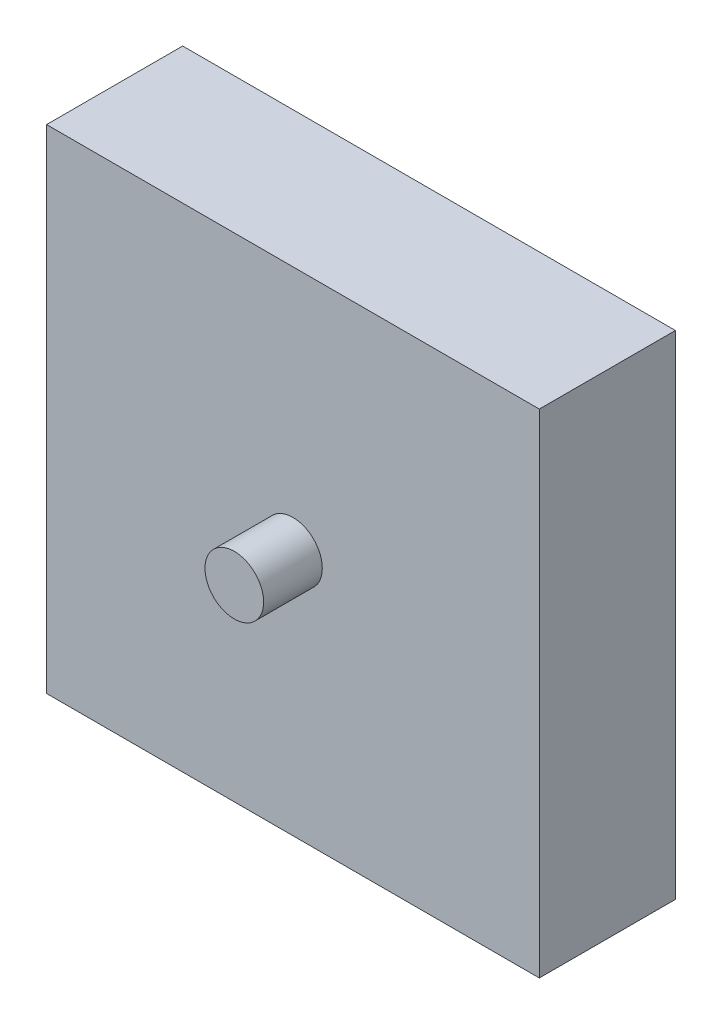
ISO-10303-21;
HEADER;
FILE_DESCRIPTION(('STEP AP214'),'2;1');
FILE_NAME('part.step','',(''),(''),'','','');
FILE_SCHEMA(('AUTOMOTIVE_DESIGN { 1 0 10303 214 1 1 1 1 }'));
ENDSEC;
DATA;
#1=APPLICATION_CONTEXT('core data for automotive mechanical design processes');
#2=APPLICATION_PROTOCOL_DEFINITION('international standard','automotive_design',2000,#1);
#3=PRODUCT_CONTEXT('',#1,'mechanical');
#4=PRODUCT('Part','Part','',(#3));
#5=PRODUCT_RELATED_PRODUCT_CATEGORY('part','',(#4));
#6=PRODUCT_DEFINITION_FORMATION('','',#4);
#7=PRODUCT_DEFINITION_CONTEXT('part definition',#1,'design');
#8=PRODUCT_DEFINITION('design','',#6,#7);
#9=PRODUCT_DEFINITION_SHAPE('','',#8);
#10=(LENGTH_UNIT() NAMED_UNIT(*) SI_UNIT(.MILLI.,.METRE.));
#11=(NAMED_UNIT(*) PLANE_ANGLE_UNIT() SI_UNIT($,.RADIAN.));
#12=(NAMED_UNIT(*) SI_UNIT($,.STERADIAN.) SOLID_ANGLE_UNIT());
#13=UNCERTAINTY_MEASURE_WITH_UNIT(LENGTH_MEASURE(1.E-05),#10,'distance_accuracy_value','');
#14=(GEOMETRIC_REPRESENTATION_CONTEXT(3) GLOBAL_UNCERTAINTY_ASSIGNED_CONTEXT((#13)) GLOBAL_UNIT_ASSIGNED_CONTEXT((#10,
#11,#12)) REPRESENTATION_CONTEXT('',''));
#15=CARTESIAN_POINT('',(0.,0.,0.));
#16=DIRECTION('',(0.,0.,1.));
#17=DIRECTION('',(1.,0.,0.));
#18=AXIS2_PLACEMENT_3D('',#15,#16,#17);
#19=CARTESIAN_POINT('',(-21.,21.,11.6));
#20=DIRECTION('',(1.,0.,0.));
#21=DIRECTION('',(0.,1.,0.));
#22=AXIS2_PLACEMENT_3D('',#19,#20,#21);
#23=PLANE('',#22);
#24=DIRECTION('',(0.,-1.,0.));
#25=VECTOR('',#24,1.);
#26=CARTESIAN_POINT('',(-21.,21.,0.));
#27=LINE('',#26,#25);
#28=CARTESIAN_POINT('',(-21.,21.,0.));
#29=VERTEX_POINT('',#28);
#30=CARTESIAN_POINT('',(-21.,-21.,0.));
#31=VERTEX_POINT('',#30);
#32=EDGE_CURVE('E101',#29,#31,#27,.T.);
#33=ORIENTED_EDGE('',*,*,#32,.T.);
#34=DIRECTION('',(0.,0.,-1.));
#35=VECTOR('',#34,1.);
#36=CARTESIAN_POINT('',(-21.,-21.,11.6));
#37=LINE('',#36,#35);
#38=CARTESIAN_POINT('',(-21.,-21.,11.6));
#39=VERTEX_POINT('',#38);
#40=EDGE_CURVE('E43',#39,#31,#37,.T.);
#41=ORIENTED_EDGE('',*,*,#40,.F.);
#42=DIRECTION('',(0.,-1.,0.));
#43=VECTOR('',#42,1.);
#44=CARTESIAN_POINT('',(-21.,21.,11.6));
#45=LINE('',#44,#43);
#46=CARTESIAN_POINT('',(-21.,21.,11.6));
#47=VERTEX_POINT('',#46);
#48=EDGE_CURVE('E87',#47,#39,#45,.T.);
#49=ORIENTED_EDGE('',*,*,#48,.F.);
#50=DIRECTION('',(0.,0.,-1.));
#51=VECTOR('',#50,1.);
#52=CARTESIAN_POINT('',(-21.,21.,11.6));
#53=LINE('',#52,#51);
#54=EDGE_CURVE('E97',#47,#29,#53,.T.);
#55=ORIENTED_EDGE('',*,*,#54,.T.);
#56=EDGE_LOOP('',(#33,#41,#49,#55));
#57=FACE_BOUND('',#56,.T.);
#58=ADVANCED_FACE('F35',(#57),#23,.F.);
#59=CARTESIAN_POINT('',(21.,-21.,11.6));
#60=DIRECTION('',(0.,1.,0.));
#61=DIRECTION('',(-1.,0.,0.));
#62=AXIS2_PLACEMENT_3D('',#59,#60,#61);
#63=PLANE('',#62);
#64=DIRECTION('',(1.,0.,0.));
#65=VECTOR('',#64,1.);
#66=CARTESIAN_POINT('',(21.,-21.,0.));
#67=LINE('',#66,#65);
#68=CARTESIAN_POINT('',(21.,-21.,0.));
#69=VERTEX_POINT('',#68);
#70=EDGE_CURVE('E92',#31,#69,#67,.T.);
#71=ORIENTED_EDGE('',*,*,#70,.T.);
#72=DIRECTION('',(0.,0.,-1.));
#73=VECTOR('',#72,1.);
#74=CARTESIAN_POINT('',(21.,-21.,11.6));
#75=LINE('',#74,#73);
#76=CARTESIAN_POINT('',(21.,-21.,11.6));
#77=VERTEX_POINT('',#76);
#78=EDGE_CURVE('E90',#77,#69,#75,.T.);
#79=ORIENTED_EDGE('',*,*,#78,.F.);
#80=DIRECTION('',(1.,0.,0.));
#81=VECTOR('',#80,1.);
#82=CARTESIAN_POINT('',(21.,-21.,11.6));
#83=LINE('',#82,#81);
#84=EDGE_CURVE('E82',#39,#77,#83,.T.);
#85=ORIENTED_EDGE('',*,*,#84,.F.);
#86=ORIENTED_EDGE('',*,*,#40,.T.);
#87=EDGE_LOOP('',(#71,#79,#85,#86));
#88=FACE_BOUND('',#87,.T.);
#89=ADVANCED_FACE('F91',(#88),#63,.F.);
#90=CARTESIAN_POINT('',(21.,21.,11.6));
#91=DIRECTION('',(-1.,0.,0.));
#92=DIRECTION('',(0.,-1.,0.));
#93=AXIS2_PLACEMENT_3D('',#90,#91,#92);
#94=PLANE('',#93);
#95=DIRECTION('',(0.,1.,0.));
#96=VECTOR('',#95,1.);
#97=CARTESIAN_POINT('',(21.,21.,0.));
#98=LINE('',#97,#96);
#99=CARTESIAN_POINT('',(21.,21.,0.));
#100=VERTEX_POINT('',#99);
#101=EDGE_CURVE('E68',#69,#100,#98,.T.);
#102=ORIENTED_EDGE('',*,*,#101,.T.);
#103=DIRECTION('',(0.,0.,-1.));
#104=VECTOR('',#103,1.);
#105=CARTESIAN_POINT('',(21.,21.,11.6));
#106=LINE('',#105,#104);
#107=CARTESIAN_POINT('',(21.,21.,11.6));
#108=VERTEX_POINT('',#107);
#109=EDGE_CURVE('E93',#108,#100,#106,.T.);
#110=ORIENTED_EDGE('',*,*,#109,.F.);
#111=DIRECTION('',(0.,1.,0.));
#112=VECTOR('',#111,1.);
#113=CARTESIAN_POINT('',(21.,21.,11.6));
#114=LINE('',#113,#112);
#115=EDGE_CURVE('E85',#77,#108,#114,.T.);
#116=ORIENTED_EDGE('',*,*,#115,.F.);
#117=ORIENTED_EDGE('',*,*,#78,.T.);
#118=EDGE_LOOP('',(#102,#110,#116,#117));
#119=FACE_BOUND('',#118,.T.);
#120=ADVANCED_FACE('F95',(#119),#94,.F.);
#121=CARTESIAN_POINT('',(21.,21.,11.6));
#122=DIRECTION('',(0.,-1.,0.));
#123=DIRECTION('',(1.,0.,0.));
#124=AXIS2_PLACEMENT_3D('',#121,#122,#123);
#125=PLANE('',#124);
#126=DIRECTION('',(-1.,0.,0.));
#127=VECTOR('',#126,1.);
#128=CARTESIAN_POINT('',(21.,21.,0.));
#129=LINE('',#128,#127);
#130=EDGE_CURVE('E74',#100,#29,#129,.T.);
#131=ORIENTED_EDGE('',*,*,#130,.T.);
#132=ORIENTED_EDGE('',*,*,#54,.F.);
#133=DIRECTION('',(-1.,0.,0.));
#134=VECTOR('',#133,1.);
#135=CARTESIAN_POINT('',(21.,21.,11.6));
#136=LINE('',#135,#134);
#137=EDGE_CURVE('E51',#108,#47,#136,.T.);
#138=ORIENTED_EDGE('',*,*,#137,.F.);
#139=ORIENTED_EDGE('',*,*,#109,.T.);
#140=EDGE_LOOP('',(#131,#132,#138,#139));
#141=FACE_BOUND('',#140,.T.);
#142=ADVANCED_FACE('F124',(#141),#125,.F.);
#143=CARTESIAN_POINT('',(0.,0.,11.6));
#144=DIRECTION('',(0.,0.,-1.));
#145=DIRECTION('',(-1.,0.,0.));
#146=AXIS2_PLACEMENT_3D('',#143,#144,#145);
#147=PLANE('',#146);
#148=CARTESIAN_POINT('',(0.,0.,11.6));
#149=DIRECTION('',(0.,0.,-1.));
#150=DIRECTION('',(-1.,0.,0.));
#151=AXIS2_PLACEMENT_3D('',#148,#149,#150);
#152=CIRCLE('',#151,2.5);
#153=CARTESIAN_POINT('',(-2.5,0.,11.6));
#154=VERTEX_POINT('',#153);
#155=EDGE_CURVE('E104',#154,#154,#152,.T.);
#156=ORIENTED_EDGE('',*,*,#155,.T.);
#157=EDGE_LOOP('',(#156));
#158=FACE_BOUND('',#157,.T.);
#159=ORIENTED_EDGE('',*,*,#48,.T.);
#160=ORIENTED_EDGE('',*,*,#84,.T.);
#161=ORIENTED_EDGE('',*,*,#115,.T.);
#162=ORIENTED_EDGE('',*,*,#137,.T.);
#163=EDGE_LOOP('',(#159,#160,#161,#162));
#164=FACE_BOUND('',#163,.T.);
#165=ADVANCED_FACE('F83',(#158,#164),#147,.F.);
#166=CARTESIAN_POINT('',(0.,0.,0.));
#167=DIRECTION('',(0.,0.,-1.));
#168=DIRECTION('',(-1.,0.,0.));
#169=AXIS2_PLACEMENT_3D('',#166,#167,#168);
#170=PLANE('',#169);
#171=CARTESIAN_POINT('',(0.,0.,0.));
#172=DIRECTION('',(0.,0.,-1.));
#173=DIRECTION('',(-1.,0.,0.));
#174=AXIS2_PLACEMENT_3D('',#171,#172,#173);
#175=CIRCLE('',#174,2.5);
#176=CARTESIAN_POINT('',(-2.5,0.,0.));
#177=VERTEX_POINT('',#176);
#178=EDGE_CURVE('E12',#177,#177,#175,.T.);
#179=ORIENTED_EDGE('',*,*,#178,.F.);
#180=EDGE_LOOP('',(#179));
#181=FACE_BOUND('',#180,.T.);
#182=ORIENTED_EDGE('',*,*,#32,.F.);
#183=ORIENTED_EDGE('',*,*,#130,.F.);
#184=ORIENTED_EDGE('',*,*,#101,.F.);
#185=ORIENTED_EDGE('',*,*,#70,.F.);
#186=EDGE_LOOP('',(#182,#183,#184,#185));
#187=FACE_BOUND('',#186,.T.);
#188=ADVANCED_FACE('F112',(#181,#187),#170,.T.);
#189=CARTESIAN_POINT('',(0.,0.,-7.));
#190=DIRECTION('',(0.,0.,-1.));
#191=DIRECTION('',(-1.,0.,0.));
#192=AXIS2_PLACEMENT_3D('',#189,#190,#191);
#193=PLANE('',#192);
#194=CARTESIAN_POINT('',(0.,0.,-7.));
#195=DIRECTION('',(0.,0.,-1.));
#196=DIRECTION('',(-1.,0.,0.));
#197=AXIS2_PLACEMENT_3D('',#194,#195,#196);
#198=CIRCLE('',#197,2.5);
#199=CARTESIAN_POINT('',(-2.5,0.,-7.));
#200=VERTEX_POINT('',#199);
#201=EDGE_CURVE('E191',#200,#200,#198,.F.);
#202=ORIENTED_EDGE('',*,*,#201,.F.);
#203=EDGE_LOOP('',(#202));
#204=FACE_BOUND('',#203,.T.);
#205=ADVANCED_FACE('F114',(#204),#193,.T.);
#206=CARTESIAN_POINT('',(0.,0.,-21.0710678118655));
#207=DIRECTION('',(0.,0.,1.));
#208=DIRECTION('',(1.,0.,0.));
#209=AXIS2_PLACEMENT_3D('',#206,#207,#208);
#210=CYLINDRICAL_SURFACE('',#209,2.5);
#211=ORIENTED_EDGE('',*,*,#178,.T.);
#212=EDGE_LOOP('',(#211));
#213=FACE_BOUND('',#212,.T.);
#214=ORIENTED_EDGE('',*,*,#201,.T.);
#215=EDGE_LOOP('',(#214));
#216=FACE_BOUND('',#215,.T.);
#217=ADVANCED_FACE('F121',(#213,#216),#210,.T.);
#218=CARTESIAN_POINT('',(0.,0.,16.6));
#219=DIRECTION('',(0.,0.,1.));
#220=DIRECTION('',(1.,0.,0.));
#221=AXIS2_PLACEMENT_3D('',#218,#219,#220);
#222=CIRCLE('',#221,2.5);
#223=CARTESIAN_POINT('',(2.5,0.,16.6));
#224=VERTEX_POINT('',#223);
#225=EDGE_CURVE('E190',#224,#224,#222,.T.);
#226=ORIENTED_EDGE('',*,*,#225,.F.);
#227=EDGE_LOOP('',(#226));
#228=FACE_BOUND('',#227,.T.);
#229=ORIENTED_EDGE('',*,*,#155,.F.);
#230=EDGE_LOOP('',(#229));
#231=FACE_BOUND('',#230,.T.);
#232=ADVANCED_FACE('F165',(#228,#231),#210,.T.);
#233=CARTESIAN_POINT('',(0.,0.,16.6));
#234=DIRECTION('',(0.,0.,1.));
#235=DIRECTION('',(1.,0.,0.));
#236=AXIS2_PLACEMENT_3D('',#233,#234,#235);
#237=PLANE('',#236);
#238=ORIENTED_EDGE('',*,*,#225,.T.);
#239=EDGE_LOOP('',(#238));
#240=FACE_BOUND('',#239,.T.);
#241=ADVANCED_FACE('F175',(#240),#237,.T.);
#242=CLOSED_SHELL('',(#58,#89,#120,#142,#165,#188,#205,#217,#232,#241));
#243=MANIFOLD_SOLID_BREP('B2',#242);
#244=ADVANCED_BREP_SHAPE_REPRESENTATION('',(#18,#243),#14);
#245=SHAPE_DEFINITION_REPRESENTATION(#9,#244);
ENDSEC;
END-ISO-10303-21;
